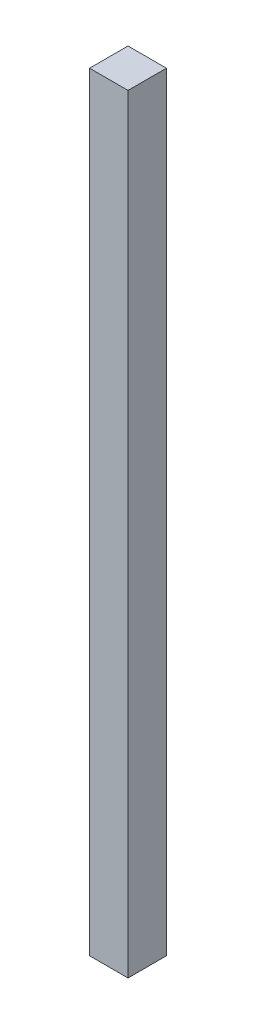
ISO-10303-21;
HEADER;
FILE_DESCRIPTION(('STEP AP214'),'2;1');
FILE_NAME('part.step','',(''),(''),'','','');
FILE_SCHEMA(('AUTOMOTIVE_DESIGN { 1 0 10303 214 1 1 1 1 }'));
ENDSEC;
DATA;
#1=APPLICATION_CONTEXT('core data for automotive mechanical design processes');
#2=APPLICATION_PROTOCOL_DEFINITION('international standard','automotive_design',2000,#1);
#3=PRODUCT_CONTEXT('',#1,'mechanical');
#4=PRODUCT('Part','Part','',(#3));
#5=PRODUCT_RELATED_PRODUCT_CATEGORY('part','',(#4));
#6=PRODUCT_DEFINITION_FORMATION('','',#4);
#7=PRODUCT_DEFINITION_CONTEXT('part definition',#1,'design');
#8=PRODUCT_DEFINITION('design','',#6,#7);
#9=PRODUCT_DEFINITION_SHAPE('','',#8);
#10=(LENGTH_UNIT() NAMED_UNIT(*) SI_UNIT(.MILLI.,.METRE.));
#11=(NAMED_UNIT(*) PLANE_ANGLE_UNIT() SI_UNIT($,.RADIAN.));
#12=(NAMED_UNIT(*) SI_UNIT($,.STERADIAN.) SOLID_ANGLE_UNIT());
#13=UNCERTAINTY_MEASURE_WITH_UNIT(LENGTH_MEASURE(1.E-05),#10,'distance_accuracy_value','');
#14=(GEOMETRIC_REPRESENTATION_CONTEXT(3) GLOBAL_UNCERTAINTY_ASSIGNED_CONTEXT((#13)) GLOBAL_UNIT_ASSIGNED_CONTEXT((#10,
#11,#12)) REPRESENTATION_CONTEXT('',''));
#15=CARTESIAN_POINT('',(0.,0.,0.));
#16=DIRECTION('',(0.,0.,1.));
#17=DIRECTION('',(1.,0.,0.));
#18=AXIS2_PLACEMENT_3D('',#15,#16,#17);
#19=CARTESIAN_POINT('',(0.,100.,0.));
#20=DIRECTION('',(1.,0.,0.));
#21=DIRECTION('',(0.,0.,-1.));
#22=AXIS2_PLACEMENT_3D('',#19,#20,#21);
#23=PLANE('',#22);
#24=DIRECTION('',(0.,0.,1.));
#25=VECTOR('',#24,1.);
#26=CARTESIAN_POINT('',(0.,0.,0.));
#27=LINE('',#26,#25);
#28=CARTESIAN_POINT('',(0.,0.,-5.));
#29=VERTEX_POINT('',#28);
#30=CARTESIAN_POINT('',(0.,0.,0.));
#31=VERTEX_POINT('',#30);
#32=EDGE_CURVE('E102',#29,#31,#27,.T.);
#33=ORIENTED_EDGE('',*,*,#32,.T.);
#34=DIRECTION('',(0.,-1.,0.));
#35=VECTOR('',#34,1.);
#36=CARTESIAN_POINT('',(0.,100.,0.));
#37=LINE('',#36,#35);
#38=CARTESIAN_POINT('',(0.,100.,0.));
#39=VERTEX_POINT('',#38);
#40=EDGE_CURVE('E11',#39,#31,#37,.T.);
#41=ORIENTED_EDGE('',*,*,#40,.F.);
#42=DIRECTION('',(0.,0.,1.));
#43=VECTOR('',#42,1.);
#44=CARTESIAN_POINT('',(0.,100.,0.));
#45=LINE('',#44,#43);
#46=CARTESIAN_POINT('',(0.,100.,-5.));
#47=VERTEX_POINT('',#46);
#48=EDGE_CURVE('E90',#47,#39,#45,.T.);
#49=ORIENTED_EDGE('',*,*,#48,.F.);
#50=DIRECTION('',(0.,-1.,0.));
#51=VECTOR('',#50,1.);
#52=CARTESIAN_POINT('',(0.,100.,-5.));
#53=LINE('',#52,#51);
#54=EDGE_CURVE('E98',#47,#29,#53,.T.);
#55=ORIENTED_EDGE('',*,*,#54,.T.);
#56=EDGE_LOOP('',(#33,#41,#49,#55));
#57=FACE_BOUND('',#56,.T.);
#58=ADVANCED_FACE('F39',(#57),#23,.F.);
#59=CARTESIAN_POINT('',(0.,100.,0.));
#60=DIRECTION('',(0.,0.,-1.));
#61=DIRECTION('',(-1.,0.,0.));
#62=AXIS2_PLACEMENT_3D('',#59,#60,#61);
#63=PLANE('',#62);
#64=DIRECTION('',(1.,0.,0.));
#65=VECTOR('',#64,1.);
#66=CARTESIAN_POINT('',(0.,0.,0.));
#67=LINE('',#66,#65);
#68=CARTESIAN_POINT('',(5.,0.,0.));
#69=VERTEX_POINT('',#68);
#70=EDGE_CURVE('E94',#31,#69,#67,.T.);
#71=ORIENTED_EDGE('',*,*,#70,.T.);
#72=DIRECTION('',(0.,-1.,0.));
#73=VECTOR('',#72,1.);
#74=CARTESIAN_POINT('',(5.,100.,0.));
#75=LINE('',#74,#73);
#76=CARTESIAN_POINT('',(5.,100.,0.));
#77=VERTEX_POINT('',#76);
#78=EDGE_CURVE('E47',#77,#69,#75,.T.);
#79=ORIENTED_EDGE('',*,*,#78,.F.);
#80=DIRECTION('',(1.,0.,0.));
#81=VECTOR('',#80,1.);
#82=CARTESIAN_POINT('',(0.,100.,0.));
#83=LINE('',#82,#81);
#84=EDGE_CURVE('E85',#39,#77,#83,.T.);
#85=ORIENTED_EDGE('',*,*,#84,.F.);
#86=ORIENTED_EDGE('',*,*,#40,.T.);
#87=EDGE_LOOP('',(#71,#79,#85,#86));
#88=FACE_BOUND('',#87,.T.);
#89=ADVANCED_FACE('F93',(#88),#63,.F.);
#90=CARTESIAN_POINT('',(5.,100.,0.));
#91=DIRECTION('',(-1.,0.,0.));
#92=DIRECTION('',(0.,0.,1.));
#93=AXIS2_PLACEMENT_3D('',#90,#91,#92);
#94=PLANE('',#93);
#95=DIRECTION('',(0.,0.,-1.));
#96=VECTOR('',#95,1.);
#97=CARTESIAN_POINT('',(5.,0.,0.));
#98=LINE('',#97,#96);
#99=CARTESIAN_POINT('',(5.,0.,-5.));
#100=VERTEX_POINT('',#99);
#101=EDGE_CURVE('E72',#69,#100,#98,.T.);
#102=ORIENTED_EDGE('',*,*,#101,.T.);
#103=DIRECTION('',(0.,-1.,0.));
#104=VECTOR('',#103,1.);
#105=CARTESIAN_POINT('',(5.,100.,-5.));
#106=LINE('',#105,#104);
#107=CARTESIAN_POINT('',(5.,100.,-5.));
#108=VERTEX_POINT('',#107);
#109=EDGE_CURVE('E95',#108,#100,#106,.T.);
#110=ORIENTED_EDGE('',*,*,#109,.F.);
#111=DIRECTION('',(0.,0.,-1.));
#112=VECTOR('',#111,1.);
#113=CARTESIAN_POINT('',(5.,100.,0.));
#114=LINE('',#113,#112);
#115=EDGE_CURVE('E88',#77,#108,#114,.T.);
#116=ORIENTED_EDGE('',*,*,#115,.F.);
#117=ORIENTED_EDGE('',*,*,#78,.T.);
#118=EDGE_LOOP('',(#102,#110,#116,#117));
#119=FACE_BOUND('',#118,.T.);
#120=ADVANCED_FACE('F96',(#119),#94,.F.);
#121=CARTESIAN_POINT('',(0.,100.,-5.));
#122=DIRECTION('',(0.,0.,1.));
#123=DIRECTION('',(1.,0.,0.));
#124=AXIS2_PLACEMENT_3D('',#121,#122,#123);
#125=PLANE('',#124);
#126=DIRECTION('',(-1.,0.,0.));
#127=VECTOR('',#126,1.);
#128=CARTESIAN_POINT('',(0.,0.,-5.));
#129=LINE('',#128,#127);
#130=EDGE_CURVE('E78',#100,#29,#129,.T.);
#131=ORIENTED_EDGE('',*,*,#130,.T.);
#132=ORIENTED_EDGE('',*,*,#54,.F.);
#133=DIRECTION('',(-1.,0.,0.));
#134=VECTOR('',#133,1.);
#135=CARTESIAN_POINT('',(0.,100.,-5.));
#136=LINE('',#135,#134);
#137=EDGE_CURVE('E55',#108,#47,#136,.T.);
#138=ORIENTED_EDGE('',*,*,#137,.F.);
#139=ORIENTED_EDGE('',*,*,#109,.T.);
#140=EDGE_LOOP('',(#131,#132,#138,#139));
#141=FACE_BOUND('',#140,.T.);
#142=ADVANCED_FACE('F109',(#141),#125,.F.);
#143=CARTESIAN_POINT('',(0.,100.,0.));
#144=DIRECTION('',(0.,-1.,0.));
#145=DIRECTION('',(0.,0.,-1.));
#146=AXIS2_PLACEMENT_3D('',#143,#144,#145);
#147=PLANE('',#146);
#148=ORIENTED_EDGE('',*,*,#48,.T.);
#149=ORIENTED_EDGE('',*,*,#84,.T.);
#150=ORIENTED_EDGE('',*,*,#115,.T.);
#151=ORIENTED_EDGE('',*,*,#137,.T.);
#152=EDGE_LOOP('',(#148,#149,#150,#151));
#153=FACE_BOUND('',#152,.T.);
#154=ADVANCED_FACE('F86',(#153),#147,.F.);
#155=CARTESIAN_POINT('',(0.,0.,0.));
#156=DIRECTION('',(0.,-1.,0.));
#157=DIRECTION('',(0.,0.,-1.));
#158=AXIS2_PLACEMENT_3D('',#155,#156,#157);
#159=PLANE('',#158);
#160=ORIENTED_EDGE('',*,*,#32,.F.);
#161=ORIENTED_EDGE('',*,*,#130,.F.);
#162=ORIENTED_EDGE('',*,*,#101,.F.);
#163=ORIENTED_EDGE('',*,*,#70,.F.);
#164=EDGE_LOOP('',(#160,#161,#162,#163));
#165=FACE_BOUND('',#164,.T.);
#166=ADVANCED_FACE('F112',(#165),#159,.T.);
#167=CLOSED_SHELL('',(#58,#89,#120,#142,#154,#166));
#168=MANIFOLD_SOLID_BREP('B2',#167);
#169=ADVANCED_BREP_SHAPE_REPRESENTATION('',(#18,#168),#14);
#170=SHAPE_DEFINITION_REPRESENTATION(#9,#169);
ENDSEC;
END-ISO-10303-21;
